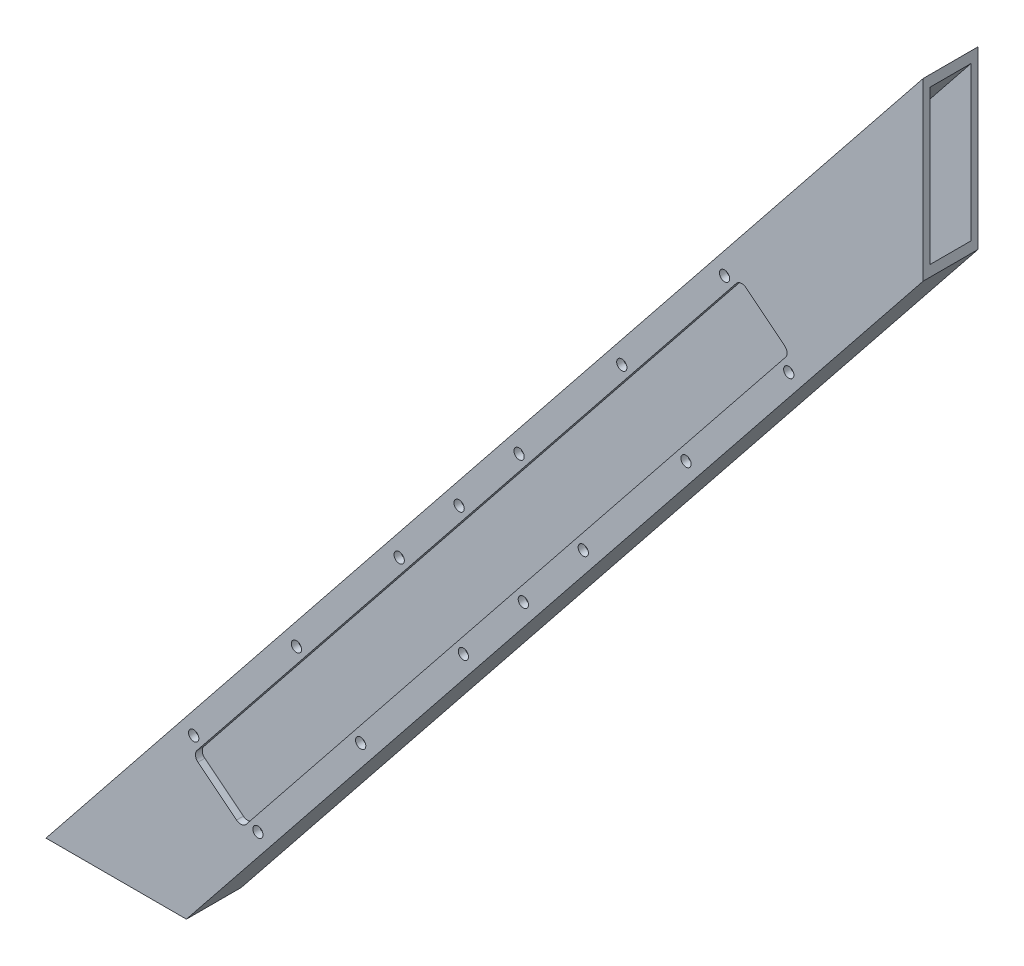
ISO-10303-21;
HEADER;
FILE_DESCRIPTION(('STEP AP214'),'2;1');
FILE_NAME('part.step','',(''),(''),'','','');
FILE_SCHEMA(('AUTOMOTIVE_DESIGN { 1 0 10303 214 1 1 1 1 }'));
ENDSEC;
DATA;
#1=APPLICATION_CONTEXT('core data for automotive mechanical design processes');
#2=APPLICATION_PROTOCOL_DEFINITION('international standard','automotive_design',2000,#1);
#3=PRODUCT_CONTEXT('',#1,'mechanical');
#4=PRODUCT('Part','Part','',(#3));
#5=PRODUCT_RELATED_PRODUCT_CATEGORY('part','',(#4));
#6=PRODUCT_DEFINITION_FORMATION('','',#4);
#7=PRODUCT_DEFINITION_CONTEXT('part definition',#1,'design');
#8=PRODUCT_DEFINITION('design','',#6,#7);
#9=PRODUCT_DEFINITION_SHAPE('','',#8);
#10=(LENGTH_UNIT() NAMED_UNIT(*) SI_UNIT(.MILLI.,.METRE.));
#11=(NAMED_UNIT(*) PLANE_ANGLE_UNIT() SI_UNIT($,.RADIAN.));
#12=(NAMED_UNIT(*) SI_UNIT($,.STERADIAN.) SOLID_ANGLE_UNIT());
#13=UNCERTAINTY_MEASURE_WITH_UNIT(LENGTH_MEASURE(1.E-05),#10,'distance_accuracy_value','');
#14=(GEOMETRIC_REPRESENTATION_CONTEXT(3) GLOBAL_UNCERTAINTY_ASSIGNED_CONTEXT((#13)) GLOBAL_UNIT_ASSIGNED_CONTEXT((#10,
#11,#12)) REPRESENTATION_CONTEXT('',''));
#15=CARTESIAN_POINT('',(0.,0.,0.));
#16=DIRECTION('',(0.,0.,1.));
#17=DIRECTION('',(1.,0.,0.));
#18=AXIS2_PLACEMENT_3D('',#15,#16,#17);
#19=CARTESIAN_POINT('',(65.0557422523179,0.,25.4));
#20=DIRECTION('',(0.,1.,0.));
#21=DIRECTION('',(-1.,0.,0.));
#22=AXIS2_PLACEMENT_3D('',#19,#20,#21);
#23=PLANE('',#22);
#24=DIRECTION('',(1.,0.,0.));
#25=VECTOR('',#24,1.);
#26=CARTESIAN_POINT('',(65.0557422523179,0.,0.));
#27=LINE('',#26,#25);
#28=CARTESIAN_POINT('',(0.,0.,0.));
#29=VERTEX_POINT('',#28);
#30=CARTESIAN_POINT('',(65.0557422523179,0.,0.));
#31=VERTEX_POINT('',#30);
#32=EDGE_CURVE('E184',#29,#31,#27,.T.);
#33=ORIENTED_EDGE('',*,*,#32,.T.);
#34=DIRECTION('',(0.,0.,-1.));
#35=VECTOR('',#34,1.);
#36=CARTESIAN_POINT('',(65.0557422523179,0.,25.4));
#37=LINE('',#36,#35);
#38=CARTESIAN_POINT('',(65.0557422523179,0.,25.4));
#39=VERTEX_POINT('',#38);
#40=EDGE_CURVE('E217',#39,#31,#37,.T.);
#41=ORIENTED_EDGE('',*,*,#40,.F.);
#42=DIRECTION('',(1.,0.,0.));
#43=VECTOR('',#42,1.);
#44=CARTESIAN_POINT('',(65.0557422523179,0.,25.4));
#45=LINE('',#44,#43);
#46=CARTESIAN_POINT('',(0.,0.,25.4));
#47=VERTEX_POINT('',#46);
#48=EDGE_CURVE('E191',#47,#39,#45,.T.);
#49=ORIENTED_EDGE('',*,*,#48,.F.);
#50=DIRECTION('',(0.,0.,-1.));
#51=VECTOR('',#50,1.);
#52=CARTESIAN_POINT('',(0.,0.,25.4));
#53=LINE('',#52,#51);
#54=EDGE_CURVE('E201',#47,#29,#53,.T.);
#55=ORIENTED_EDGE('',*,*,#54,.T.);
#56=EDGE_LOOP('',(#33,#41,#49,#55));
#57=FACE_BOUND('',#56,.T.);
#58=DIRECTION('',(1.,0.,0.));
#59=VECTOR('',#58,1.);
#60=CARTESIAN_POINT('',(65.0557422523179,0.,3.175));
#61=LINE('',#60,#59);
#62=CARTESIAN_POINT('',(4.06598389076986,0.,3.175));
#63=VERTEX_POINT('',#62);
#64=CARTESIAN_POINT('',(60.989758361548,0.,3.175));
#65=VERTEX_POINT('',#64);
#66=EDGE_CURVE('E156',#63,#65,#61,.T.);
#67=ORIENTED_EDGE('',*,*,#66,.F.);
#68=DIRECTION('',(0.,0.,-1.));
#69=VECTOR('',#68,1.);
#70=CARTESIAN_POINT('',(4.06598389076986,0.,25.4));
#71=LINE('',#70,#69);
#72=CARTESIAN_POINT('',(4.06598389076986,0.,22.225));
#73=VERTEX_POINT('',#72);
#74=EDGE_CURVE('E179',#73,#63,#71,.T.);
#75=ORIENTED_EDGE('',*,*,#74,.F.);
#76=DIRECTION('',(1.,0.,0.));
#77=VECTOR('',#76,1.);
#78=CARTESIAN_POINT('',(65.0557422523179,0.,22.225));
#79=LINE('',#78,#77);
#80=CARTESIAN_POINT('',(60.989758361548,0.,22.225));
#81=VERTEX_POINT('',#80);
#82=EDGE_CURVE('E175',#73,#81,#79,.T.);
#83=ORIENTED_EDGE('',*,*,#82,.T.);
#84=DIRECTION('',(0.,0.,-1.));
#85=VECTOR('',#84,1.);
#86=CARTESIAN_POINT('',(60.989758361548,0.,25.4));
#87=LINE('',#86,#85);
#88=EDGE_CURVE('E168',#81,#65,#87,.T.);
#89=ORIENTED_EDGE('',*,*,#88,.T.);
#90=EDGE_LOOP('',(#67,#75,#83,#89));
#91=FACE_BOUND('',#90,.T.);
#92=ADVANCED_FACE('F37',(#57,#91),#23,.F.);
#93=CARTESIAN_POINT('',(406.4,508.,25.4));
#94=DIRECTION('',(-1.,0.,0.));
#95=DIRECTION('',(0.,0.,1.));
#96=AXIS2_PLACEMENT_3D('',#93,#94,#95);
#97=PLANE('',#96);
#98=DIRECTION('',(0.,1.,0.));
#99=VECTOR('',#98,1.);
#100=CARTESIAN_POINT('',(406.4,508.,0.));
#101=LINE('',#100,#99);
#102=CARTESIAN_POINT('',(406.4,426.680322184603,0.));
#103=VERTEX_POINT('',#102);
#104=CARTESIAN_POINT('',(406.4,508.,0.));
#105=VERTEX_POINT('',#104);
#106=EDGE_CURVE('E206',#103,#105,#101,.T.);
#107=ORIENTED_EDGE('',*,*,#106,.T.);
#108=DIRECTION('',(0.,0.,-1.));
#109=VECTOR('',#108,1.);
#110=CARTESIAN_POINT('',(406.4,508.,25.4));
#111=LINE('',#110,#109);
#112=CARTESIAN_POINT('',(406.4,508.,25.4));
#113=VERTEX_POINT('',#112);
#114=EDGE_CURVE('E211',#113,#105,#111,.T.);
#115=ORIENTED_EDGE('',*,*,#114,.F.);
#116=DIRECTION('',(0.,1.,0.));
#117=VECTOR('',#116,1.);
#118=CARTESIAN_POINT('',(406.4,508.,25.4));
#119=LINE('',#118,#117);
#120=CARTESIAN_POINT('',(406.4,426.680322184603,25.4));
#121=VERTEX_POINT('',#120);
#122=EDGE_CURVE('E197',#121,#113,#119,.T.);
#123=ORIENTED_EDGE('',*,*,#122,.F.);
#124=DIRECTION('',(0.,0.,-1.));
#125=VECTOR('',#124,1.);
#126=CARTESIAN_POINT('',(406.4,426.680322184603,25.4));
#127=LINE('',#126,#125);
#128=EDGE_CURVE('E214',#121,#103,#127,.T.);
#129=ORIENTED_EDGE('',*,*,#128,.T.);
#130=EDGE_LOOP('',(#107,#115,#123,#129));
#131=FACE_BOUND('',#130,.T.);
#132=DIRECTION('',(0.,1.,0.));
#133=VECTOR('',#132,1.);
#134=CARTESIAN_POINT('',(406.4,508.,3.175));
#135=LINE('',#134,#133);
#136=CARTESIAN_POINT('',(406.4,431.762802048065,3.175));
#137=VERTEX_POINT('',#136);
#138=CARTESIAN_POINT('',(406.4,502.917520136538,3.175));
#139=VERTEX_POINT('',#138);
#140=EDGE_CURVE('E153',#137,#139,#135,.T.);
#141=ORIENTED_EDGE('',*,*,#140,.F.);
#142=DIRECTION('',(0.,0.,-1.));
#143=VECTOR('',#142,1.);
#144=CARTESIAN_POINT('',(406.4,431.762802048065,25.4));
#145=LINE('',#144,#143);
#146=CARTESIAN_POINT('',(406.4,431.762802048065,22.225));
#147=VERTEX_POINT('',#146);
#148=EDGE_CURVE('E163',#147,#137,#145,.T.);
#149=ORIENTED_EDGE('',*,*,#148,.F.);
#150=DIRECTION('',(0.,1.,0.));
#151=VECTOR('',#150,1.);
#152=CARTESIAN_POINT('',(406.4,508.,22.225));
#153=LINE('',#152,#151);
#154=CARTESIAN_POINT('',(406.4,502.917520136538,22.225));
#155=VERTEX_POINT('',#154);
#156=EDGE_CURVE('E180',#147,#155,#153,.T.);
#157=ORIENTED_EDGE('',*,*,#156,.T.);
#158=DIRECTION('',(0.,0.,-1.));
#159=VECTOR('',#158,1.);
#160=CARTESIAN_POINT('',(406.4,502.917520136538,25.4));
#161=LINE('',#160,#159);
#162=EDGE_CURVE('E169',#155,#139,#161,.T.);
#163=ORIENTED_EDGE('',*,*,#162,.T.);
#164=EDGE_LOOP('',(#141,#149,#157,#163));
#165=FACE_BOUND('',#164,.T.);
#166=ADVANCED_FACE('F172',(#131,#165),#97,.F.);
#167=CARTESIAN_POINT('',(406.4,426.680322184603,25.4));
#168=DIRECTION('',(-0.78086880944303,0.624695047554424,0.));
#169=DIRECTION('',(-0.624695047554424,-0.780868809443031,0.));
#170=AXIS2_PLACEMENT_3D('',#167,#168,#169);
#171=PLANE('',#170);
#172=DIRECTION('',(0.624695047554424,0.78086880944303,0.));
#173=VECTOR('',#172,1.);
#174=CARTESIAN_POINT('',(406.4,426.680322184603,0.));
#175=LINE('',#174,#173);
#176=EDGE_CURVE('E204',#31,#103,#175,.T.);
#177=ORIENTED_EDGE('',*,*,#176,.T.);
#178=ORIENTED_EDGE('',*,*,#128,.F.);
#179=DIRECTION('',(0.624695047554424,0.78086880944303,0.));
#180=VECTOR('',#179,1.);
#181=CARTESIAN_POINT('',(406.4,426.680322184603,25.4));
#182=LINE('',#181,#180);
#183=EDGE_CURVE('E194',#39,#121,#182,.T.);
#184=ORIENTED_EDGE('',*,*,#183,.F.);
#185=ORIENTED_EDGE('',*,*,#40,.T.);
#186=EDGE_LOOP('',(#177,#178,#184,#185));
#187=FACE_BOUND('',#186,.T.);
#188=ADVANCED_FACE('F365',(#187),#171,.F.);
#189=CARTESIAN_POINT('',(0.,0.,25.4));
#190=DIRECTION('',(0.78086880944303,-0.624695047554424,0.));
#191=DIRECTION('',(0.624695047554424,0.780868809443031,0.));
#192=AXIS2_PLACEMENT_3D('',#189,#190,#191);
#193=PLANE('',#192);
#194=DIRECTION('',(-0.624695047554424,-0.78086880944303,0.));
#195=VECTOR('',#194,1.);
#196=CARTESIAN_POINT('',(0.,0.,0.));
#197=LINE('',#196,#195);
#198=EDGE_CURVE('E195',#105,#29,#197,.T.);
#199=ORIENTED_EDGE('',*,*,#198,.T.);
#200=ORIENTED_EDGE('',*,*,#54,.F.);
#201=DIRECTION('',(-0.624695047554424,-0.78086880944303,0.));
#202=VECTOR('',#201,1.);
#203=CARTESIAN_POINT('',(0.,0.,25.4));
#204=LINE('',#203,#202);
#205=EDGE_CURVE('E199',#113,#47,#204,.T.);
#206=ORIENTED_EDGE('',*,*,#205,.F.);
#207=ORIENTED_EDGE('',*,*,#114,.T.);
#208=EDGE_LOOP('',(#199,#200,#206,#207));
#209=FACE_BOUND('',#208,.T.);
#210=ADVANCED_FACE('F474',(#209),#193,.F.);
#211=CARTESIAN_POINT('',(0.,0.,25.4));
#212=DIRECTION('',(0.,0.,1.));
#213=DIRECTION('',(1.,0.,0.));
#214=AXIS2_PLACEMENT_3D('',#211,#212,#213);
#215=PLANE('',#214);
#216=CARTESIAN_POINT('',(296.519313009802,299.49442317378,25.4));
#217=DIRECTION('',(0.,0.,1.));
#218=DIRECTION('',(1.,0.,0.));
#219=AXIS2_PLACEMENT_3D('',#216,#217,#218);
#220=CIRCLE('',#219,2.38125000000007);
#221=CARTESIAN_POINT('',(298.900563009802,299.49442317378,25.4));
#222=VERTEX_POINT('',#221);
#223=EDGE_CURVE('E699',#222,#222,#220,.T.);
#224=ORIENTED_EDGE('',*,*,#223,.F.);
#225=EDGE_LOOP('',(#224));
#226=FACE_BOUND('',#225,.T.);
#227=CARTESIAN_POINT('',(344.121075633449,358.996626453339,25.4));
#228=DIRECTION('',(0.,0.,1.));
#229=DIRECTION('',(1.,0.,0.));
#230=AXIS2_PLACEMENT_3D('',#227,#228,#229);
#231=CIRCLE('',#230,2.38125000000001);
#232=CARTESIAN_POINT('',(346.502325633449,358.996626453339,25.4));
#233=VERTEX_POINT('',#232);
#234=EDGE_CURVE('E701',#233,#233,#231,.T.);
#235=ORIENTED_EDGE('',*,*,#234,.F.);
#236=EDGE_LOOP('',(#235));
#237=FACE_BOUND('',#236,.T.);
#238=CARTESIAN_POINT('',(98.1786354112725,51.5685761756177,25.4));
#239=DIRECTION('',(0.,0.,1.));
#240=DIRECTION('',(-1.,0.,0.));
#241=AXIS2_PLACEMENT_3D('',#238,#239,#240);
#242=CIRCLE('',#241,2.38125);
#243=CARTESIAN_POINT('',(95.7973854112725,51.5685761756177,25.4));
#244=VERTEX_POINT('',#243);
#245=EDGE_CURVE('E705',#244,#244,#242,.T.);
#246=ORIENTED_EDGE('',*,*,#245,.F.);
#247=EDGE_LOOP('',(#246));
#248=FACE_BOUND('',#247,.T.);
#249=CARTESIAN_POINT('',(145.78039803492,111.070779455177,25.4));
#250=DIRECTION('',(0.,0.,1.));
#251=DIRECTION('',(-1.,0.,0.));
#252=AXIS2_PLACEMENT_3D('',#249,#250,#251);
#253=CIRCLE('',#252,2.38125);
#254=CARTESIAN_POINT('',(143.39914803492,111.070779455177,25.4));
#255=VERTEX_POINT('',#254);
#256=EDGE_CURVE('E721',#255,#255,#253,.T.);
#257=ORIENTED_EDGE('',*,*,#256,.F.);
#258=EDGE_LOOP('',(#257));
#259=FACE_BOUND('',#258,.T.);
#260=CARTESIAN_POINT('',(193.382160658567,170.572982734736,25.4));
#261=DIRECTION('',(0.,0.,1.));
#262=DIRECTION('',(-1.,0.,0.));
#263=AXIS2_PLACEMENT_3D('',#260,#261,#262);
#264=CIRCLE('',#263,2.38124999999995);
#265=CARTESIAN_POINT('',(191.000910658567,170.572982734736,25.4));
#266=VERTEX_POINT('',#265);
#267=EDGE_CURVE('E719',#266,#266,#264,.T.);
#268=ORIENTED_EDGE('',*,*,#267,.F.);
#269=EDGE_LOOP('',(#268));
#270=FACE_BOUND('',#269,.T.);
#271=CARTESIAN_POINT('',(163.631059018787,194.373864046559,25.4));
#272=DIRECTION('',(0.,0.,1.));
#273=DIRECTION('',(1.,0.,0.));
#274=AXIS2_PLACEMENT_3D('',#271,#272,#273);
#275=CIRCLE('',#274,2.38124999999998);
#276=CARTESIAN_POINT('',(166.012309018787,194.373864046559,25.4));
#277=VERTEX_POINT('',#276);
#278=EDGE_CURVE('E717',#277,#277,#275,.T.);
#279=ORIENTED_EDGE('',*,*,#278,.F.);
#280=EDGE_LOOP('',(#279));
#281=FACE_BOUND('',#280,.T.);
#282=CARTESIAN_POINT('',(116.02929639514,134.871660767,25.4));
#283=DIRECTION('',(0.,0.,1.));
#284=DIRECTION('',(1.,0.,0.));
#285=AXIS2_PLACEMENT_3D('',#282,#283,#284);
#286=CIRCLE('',#285,2.38125);
#287=CARTESIAN_POINT('',(118.41054639514,134.871660767,25.4));
#288=VERTEX_POINT('',#287);
#289=EDGE_CURVE('E714',#288,#288,#286,.T.);
#290=ORIENTED_EDGE('',*,*,#289,.F.);
#291=EDGE_LOOP('',(#290));
#292=FACE_BOUND('',#291,.T.);
#293=CARTESIAN_POINT('',(68.4275337714929,75.3694574874414,25.4));
#294=DIRECTION('',(0.,0.,1.));
#295=DIRECTION('',(1.,0.,0.));
#296=AXIS2_PLACEMENT_3D('',#293,#294,#295);
#297=CIRCLE('',#296,2.38125);
#298=CARTESIAN_POINT('',(70.8087837714929,75.3694574874414,25.4));
#299=VERTEX_POINT('',#298);
#300=EDGE_CURVE('E336',#299,#299,#297,.T.);
#301=ORIENTED_EDGE('',*,*,#300,.F.);
#302=EDGE_LOOP('',(#301));
#303=FACE_BOUND('',#302,.T.);
#304=CARTESIAN_POINT('',(248.917550386155,239.992219894221,25.4));
#305=DIRECTION('',(0.,0.,1.));
#306=DIRECTION('',(1.,0.,0.));
#307=AXIS2_PLACEMENT_3D('',#304,#305,#306);
#308=CIRCLE('',#307,2.38124999999986);
#309=CARTESIAN_POINT('',(251.298800386155,239.992219894221,25.4));
#310=VERTEX_POINT('',#309);
#311=EDGE_CURVE('E702',#310,#310,#308,.T.);
#312=ORIENTED_EDGE('',*,*,#311,.F.);
#313=EDGE_LOOP('',(#312));
#314=FACE_BOUND('',#313,.T.);
#315=CARTESIAN_POINT('',(219.166448746375,263.793101206044,25.4));
#316=DIRECTION('',(0.,0.,1.));
#317=DIRECTION('',(-1.,0.,0.));
#318=AXIS2_PLACEMENT_3D('',#315,#316,#317);
#319=CIRCLE('',#318,2.38124999999994);
#320=CARTESIAN_POINT('',(216.785198746375,263.793101206044,25.4));
#321=VERTEX_POINT('',#320);
#322=EDGE_CURVE('E708',#321,#321,#319,.T.);
#323=ORIENTED_EDGE('',*,*,#322,.F.);
#324=EDGE_LOOP('',(#323));
#325=FACE_BOUND('',#324,.T.);
#326=CARTESIAN_POINT('',(266.768211370022,323.295304485603,25.4));
#327=DIRECTION('',(0.,0.,1.));
#328=DIRECTION('',(-1.,0.,0.));
#329=AXIS2_PLACEMENT_3D('',#326,#327,#328);
#330=CIRCLE('',#329,2.38125000000001);
#331=CARTESIAN_POINT('',(264.386961370022,323.295304485603,25.4));
#332=VERTEX_POINT('',#331);
#333=EDGE_CURVE('E737',#332,#332,#330,.T.);
#334=ORIENTED_EDGE('',*,*,#333,.F.);
#335=EDGE_LOOP('',(#334));
#336=FACE_BOUND('',#335,.T.);
#337=CARTESIAN_POINT('',(314.369973993669,382.797507765162,25.4));
#338=DIRECTION('',(0.,0.,1.));
#339=DIRECTION('',(-1.,0.,0.));
#340=AXIS2_PLACEMENT_3D('',#337,#338,#339);
#341=CIRCLE('',#340,2.38125000000001);
#342=CARTESIAN_POINT('',(311.988723993669,382.797507765162,25.4));
#343=VERTEX_POINT('',#342);
#344=EDGE_CURVE('E734',#343,#343,#341,.T.);
#345=ORIENTED_EDGE('',*,*,#344,.F.);
#346=EDGE_LOOP('',(#345));
#347=FACE_BOUND('',#346,.T.);
#348=CARTESIAN_POINT('',(191.398753882581,229.083482626302,25.4));
#349=DIRECTION('',(0.,0.,1.));
#350=DIRECTION('',(1.,0.,0.));
#351=AXIS2_PLACEMENT_3D('',#348,#349,#350);
#352=CIRCLE('',#351,2.38125);
#353=CARTESIAN_POINT('',(193.780003882581,229.083482626302,25.4));
#354=VERTEX_POINT('',#353);
#355=EDGE_CURVE('E731',#354,#354,#352,.T.);
#356=ORIENTED_EDGE('',*,*,#355,.F.);
#357=EDGE_LOOP('',(#356));
#358=FACE_BOUND('',#357,.T.);
#359=CARTESIAN_POINT('',(221.149855522361,205.282601314478,25.4));
#360=DIRECTION('',(0.,0.,1.));
#361=DIRECTION('',(1.,0.,0.));
#362=AXIS2_PLACEMENT_3D('',#359,#360,#361);
#363=CIRCLE('',#362,2.38125);
#364=CARTESIAN_POINT('',(223.531105522361,205.282601314478,25.4));
#365=VERTEX_POINT('',#364);
#366=EDGE_CURVE('E728',#365,#365,#363,.T.);
#367=ORIENTED_EDGE('',*,*,#366,.F.);
#368=EDGE_LOOP('',(#367));
#369=FACE_BOUND('',#368,.T.);
#370=DIRECTION('',(0.78086880944303,-0.624695047554425,0.));
#371=VECTOR('',#370,1.);
#372=CARTESIAN_POINT('',(90.7408600013274,49.3868287220339,25.4));
#373=LINE('',#372,#371);
#374=CARTESIAN_POINT('',(70.4109405474781,65.6507642851133,25.4));
#375=VERTEX_POINT('',#374);
#376=CARTESIAN_POINT('',(88.2616015313457,51.3702354980192,25.4));
#377=VERTEX_POINT('',#376);
#378=EDGE_CURVE('E308',#375,#377,#373,.T.);
#379=ORIENTED_EDGE('',*,*,#378,.F.);
#380=CARTESIAN_POINT('',(72.3943473234634,68.1300227550949,25.4));
#381=DIRECTION('',(0.,0.,1.));
#382=DIRECTION('',(1.,0.,0.));
#383=AXIS2_PLACEMENT_3D('',#380,#381,#382);
#384=CIRCLE('',#383,3.175);
#385=CARTESIAN_POINT('',(69.9150888534818,70.1134295310802,25.4));
#386=VERTEX_POINT('',#385);
#387=EDGE_CURVE('E45',#375,#386,#384,.F.);
#388=ORIENTED_EDGE('',*,*,#387,.T.);
#389=DIRECTION('',(-0.624695047554424,-0.780868809443031,0.));
#390=VECTOR('',#389,1.);
#391=CARTESIAN_POINT('',(67.9316820774965,67.6341710610986,25.4));
#392=LINE('',#391,#390);
#393=CARTESIAN_POINT('',(319.824342627629,382.499996748765,25.4));
#394=VERTEX_POINT('',#393);
#395=EDGE_CURVE('E235',#394,#386,#392,.T.);
#396=ORIENTED_EDGE('',*,*,#395,.F.);
#397=CARTESIAN_POINT('',(322.303601097611,380.516589972779,25.4));
#398=DIRECTION('',(0.,0.,1.));
#399=DIRECTION('',(1.,0.,0.));
#400=AXIS2_PLACEMENT_3D('',#397,#398,#399);
#401=CIRCLE('',#400,3.175);
#402=CARTESIAN_POINT('',(324.287007873596,382.995848442761,25.4));
#403=VERTEX_POINT('',#402);
#404=EDGE_CURVE('E291',#394,#403,#401,.F.);
#405=ORIENTED_EDGE('',*,*,#404,.T.);
#406=DIRECTION('',(-0.780868809443031,0.624695047554424,0.));
#407=VECTOR('',#406,1.);
#408=CARTESIAN_POINT('',(344.616927327445,366.731912879681,25.4));
#409=LINE('',#408,#407);
#410=CARTESIAN_POINT('',(342.137668857464,368.715319655667,25.4));
#411=VERTEX_POINT('',#410);
#412=EDGE_CURVE('E316',#411,#403,#409,.T.);
#413=ORIENTED_EDGE('',*,*,#412,.F.);
#414=CARTESIAN_POINT('',(340.154262081478,366.236061185685,25.4));
#415=DIRECTION('',(0.,0.,1.));
#416=DIRECTION('',(1.,0.,0.));
#417=AXIS2_PLACEMENT_3D('',#414,#415,#416);
#418=CIRCLE('',#417,3.175);
#419=CARTESIAN_POINT('',(342.63352055146,364.2526544097,25.4));
#420=VERTEX_POINT('',#419);
#421=EDGE_CURVE('E295',#411,#420,#418,.F.);
#422=ORIENTED_EDGE('',*,*,#421,.T.);
#423=DIRECTION('',(0.624695047554424,0.780868809443031,0.));
#424=VECTOR('',#423,1.);
#425=CARTESIAN_POINT('',(90.7408600013274,49.3868287220339,25.4));
#426=LINE('',#425,#424);
#427=CARTESIAN_POINT('',(92.7242667773127,51.8660871920155,25.4));
#428=VERTEX_POINT('',#427);
#429=EDGE_CURVE('E330',#428,#420,#426,.T.);
#430=ORIENTED_EDGE('',*,*,#429,.F.);
#431=CARTESIAN_POINT('',(90.245008307331,53.8494939680008,25.4));
#432=DIRECTION('',(0.,0.,1.));
#433=DIRECTION('',(1.,0.,0.));
#434=AXIS2_PLACEMENT_3D('',#431,#432,#433);
#435=CIRCLE('',#434,3.175);
#436=EDGE_CURVE('E299',#428,#377,#435,.F.);
#437=ORIENTED_EDGE('',*,*,#436,.T.);
#438=EDGE_LOOP('',(#379,#388,#396,#405,#413,#422,#430,#437));
#439=FACE_BOUND('',#438,.T.);
#440=ORIENTED_EDGE('',*,*,#48,.T.);
#441=ORIENTED_EDGE('',*,*,#183,.T.);
#442=ORIENTED_EDGE('',*,*,#122,.T.);
#443=ORIENTED_EDGE('',*,*,#205,.T.);
#444=EDGE_LOOP('',(#440,#441,#442,#443));
#445=FACE_BOUND('',#444,.T.);
#446=ADVANCED_FACE('F306',(#226,#237,#248,#259,#270,#281,#292,#303,#314,#325,#336,#347,#358,
#369,#439,#445),#215,.T.);
#447=CARTESIAN_POINT('',(0.,0.,0.));
#448=DIRECTION('',(0.,0.,1.));
#449=DIRECTION('',(1.,0.,0.));
#450=AXIS2_PLACEMENT_3D('',#447,#448,#449);
#451=PLANE('',#450);
#452=ORIENTED_EDGE('',*,*,#32,.F.);
#453=ORIENTED_EDGE('',*,*,#198,.F.);
#454=ORIENTED_EDGE('',*,*,#106,.F.);
#455=ORIENTED_EDGE('',*,*,#176,.F.);
#456=EDGE_LOOP('',(#452,#453,#454,#455));
#457=FACE_BOUND('',#456,.T.);
#458=ADVANCED_FACE('F458',(#457),#451,.F.);
#459=CARTESIAN_POINT('',(403.920741530018,428.663728960588,25.4));
#460=DIRECTION('',(-0.78086880944303,0.624695047554424,0.));
#461=DIRECTION('',(-0.624695047554424,-0.780868809443031,0.));
#462=AXIS2_PLACEMENT_3D('',#459,#460,#461);
#463=PLANE('',#462);
#464=DIRECTION('',(0.624695047554424,0.780868809443031,0.));
#465=VECTOR('',#464,1.);
#466=CARTESIAN_POINT('',(403.920741530018,428.663728960588,3.175));
#467=LINE('',#466,#465);
#468=EDGE_CURVE('E149',#65,#137,#467,.T.);
#469=ORIENTED_EDGE('',*,*,#468,.F.);
#470=ORIENTED_EDGE('',*,*,#88,.F.);
#471=DIRECTION('',(0.624695047554424,0.780868809443031,0.));
#472=VECTOR('',#471,1.);
#473=CARTESIAN_POINT('',(403.920741530018,428.663728960588,22.225));
#474=LINE('',#473,#472);
#475=EDGE_CURVE('E165',#81,#147,#474,.T.);
#476=ORIENTED_EDGE('',*,*,#475,.T.);
#477=ORIENTED_EDGE('',*,*,#148,.T.);
#478=EDGE_LOOP('',(#469,#470,#476,#477));
#479=FACE_BOUND('',#478,.T.);
#480=ADVANCED_FACE('F164',(#479),#463,.T.);
#481=CARTESIAN_POINT('',(2.47925846998162,-1.9834067759853,25.4));
#482=DIRECTION('',(0.78086880944303,-0.624695047554424,0.));
#483=DIRECTION('',(0.624695047554424,0.780868809443031,0.));
#484=AXIS2_PLACEMENT_3D('',#481,#482,#483);
#485=PLANE('',#484);
#486=DIRECTION('',(-0.624695047554424,-0.780868809443031,0.));
#487=VECTOR('',#486,1.);
#488=CARTESIAN_POINT('',(2.47925846998162,-1.9834067759853,3.175));
#489=LINE('',#488,#487);
#490=EDGE_CURVE('E173',#139,#63,#489,.T.);
#491=ORIENTED_EDGE('',*,*,#490,.F.);
#492=ORIENTED_EDGE('',*,*,#162,.F.);
#493=DIRECTION('',(-0.624695047554424,-0.780868809443031,0.));
#494=VECTOR('',#493,1.);
#495=CARTESIAN_POINT('',(2.47925846998162,-1.9834067759853,22.225));
#496=LINE('',#495,#494);
#497=EDGE_CURVE('E182',#155,#73,#496,.T.);
#498=ORIENTED_EDGE('',*,*,#497,.T.);
#499=ORIENTED_EDGE('',*,*,#74,.T.);
#500=EDGE_LOOP('',(#491,#492,#498,#499));
#501=FACE_BOUND('',#500,.T.);
#502=ADVANCED_FACE('F345',(#501),#485,.T.);
#503=CARTESIAN_POINT('',(0.,0.,22.225));
#504=DIRECTION('',(0.,0.,1.));
#505=DIRECTION('',(1.,0.,0.));
#506=AXIS2_PLACEMENT_3D('',#503,#504,#505);
#507=PLANE('',#506);
#508=CARTESIAN_POINT('',(296.519313009802,299.49442317378,22.225));
#509=DIRECTION('',(0.,0.,1.));
#510=DIRECTION('',(1.,0.,0.));
#511=AXIS2_PLACEMENT_3D('',#508,#509,#510);
#512=CIRCLE('',#511,2.38125000000007);
#513=CARTESIAN_POINT('',(298.900563009802,299.49442317378,22.225));
#514=VERTEX_POINT('',#513);
#515=EDGE_CURVE('E190',#514,#514,#512,.T.);
#516=ORIENTED_EDGE('',*,*,#515,.T.);
#517=EDGE_LOOP('',(#516));
#518=FACE_BOUND('',#517,.T.);
#519=CARTESIAN_POINT('',(344.121075633449,358.996626453339,22.225));
#520=DIRECTION('',(0.,0.,1.));
#521=DIRECTION('',(1.,0.,0.));
#522=AXIS2_PLACEMENT_3D('',#519,#520,#521);
#523=CIRCLE('',#522,2.38125000000001);
#524=CARTESIAN_POINT('',(346.502325633449,358.996626453339,22.225));
#525=VERTEX_POINT('',#524);
#526=EDGE_CURVE('E268',#525,#525,#523,.T.);
#527=ORIENTED_EDGE('',*,*,#526,.T.);
#528=EDGE_LOOP('',(#527));
#529=FACE_BOUND('',#528,.T.);
#530=CARTESIAN_POINT('',(98.1786354112725,51.5685761756177,22.225));
#531=DIRECTION('',(0.,0.,1.));
#532=DIRECTION('',(1.,0.,0.));
#533=AXIS2_PLACEMENT_3D('',#530,#531,#532);
#534=CIRCLE('',#533,2.38125);
#535=CARTESIAN_POINT('',(100.559885411272,51.5685761756177,22.225));
#536=VERTEX_POINT('',#535);
#537=EDGE_CURVE('E265',#536,#536,#534,.T.);
#538=ORIENTED_EDGE('',*,*,#537,.T.);
#539=EDGE_LOOP('',(#538));
#540=FACE_BOUND('',#539,.T.);
#541=CARTESIAN_POINT('',(145.78039803492,111.070779455177,22.225));
#542=DIRECTION('',(0.,0.,1.));
#543=DIRECTION('',(1.,0.,0.));
#544=AXIS2_PLACEMENT_3D('',#541,#542,#543);
#545=CIRCLE('',#544,2.38125);
#546=CARTESIAN_POINT('',(148.16164803492,111.070779455177,22.225));
#547=VERTEX_POINT('',#546);
#548=EDGE_CURVE('E262',#547,#547,#545,.T.);
#549=ORIENTED_EDGE('',*,*,#548,.T.);
#550=EDGE_LOOP('',(#549));
#551=FACE_BOUND('',#550,.T.);
#552=CARTESIAN_POINT('',(193.382160658567,170.572982734736,22.225));
#553=DIRECTION('',(0.,0.,1.));
#554=DIRECTION('',(1.,0.,0.));
#555=AXIS2_PLACEMENT_3D('',#552,#553,#554);
#556=CIRCLE('',#555,2.38124999999995);
#557=CARTESIAN_POINT('',(195.763410658567,170.572982734736,22.225));
#558=VERTEX_POINT('',#557);
#559=EDGE_CURVE('E259',#558,#558,#556,.T.);
#560=ORIENTED_EDGE('',*,*,#559,.T.);
#561=EDGE_LOOP('',(#560));
#562=FACE_BOUND('',#561,.T.);
#563=CARTESIAN_POINT('',(163.631059018787,194.373864046559,22.225));
#564=DIRECTION('',(0.,0.,1.));
#565=DIRECTION('',(1.,0.,0.));
#566=AXIS2_PLACEMENT_3D('',#563,#564,#565);
#567=CIRCLE('',#566,2.38124999999998);
#568=CARTESIAN_POINT('',(166.012309018787,194.373864046559,22.225));
#569=VERTEX_POINT('',#568);
#570=EDGE_CURVE('E256',#569,#569,#567,.T.);
#571=ORIENTED_EDGE('',*,*,#570,.T.);
#572=EDGE_LOOP('',(#571));
#573=FACE_BOUND('',#572,.T.);
#574=CARTESIAN_POINT('',(116.02929639514,134.871660767,22.225));
#575=DIRECTION('',(0.,0.,1.));
#576=DIRECTION('',(1.,0.,0.));
#577=AXIS2_PLACEMENT_3D('',#574,#575,#576);
#578=CIRCLE('',#577,2.38125);
#579=CARTESIAN_POINT('',(118.41054639514,134.871660767,22.225));
#580=VERTEX_POINT('',#579);
#581=EDGE_CURVE('E253',#580,#580,#578,.T.);
#582=ORIENTED_EDGE('',*,*,#581,.T.);
#583=EDGE_LOOP('',(#582));
#584=FACE_BOUND('',#583,.T.);
#585=CARTESIAN_POINT('',(68.4275337714929,75.3694574874414,22.225));
#586=DIRECTION('',(0.,0.,1.));
#587=DIRECTION('',(1.,0.,0.));
#588=AXIS2_PLACEMENT_3D('',#585,#586,#587);
#589=CIRCLE('',#588,2.38125);
#590=CARTESIAN_POINT('',(70.8087837714929,75.3694574874414,22.225));
#591=VERTEX_POINT('',#590);
#592=EDGE_CURVE('E250',#591,#591,#589,.T.);
#593=ORIENTED_EDGE('',*,*,#592,.T.);
#594=EDGE_LOOP('',(#593));
#595=FACE_BOUND('',#594,.T.);
#596=CARTESIAN_POINT('',(248.917550386155,239.992219894221,22.225));
#597=DIRECTION('',(0.,0.,1.));
#598=DIRECTION('',(1.,0.,0.));
#599=AXIS2_PLACEMENT_3D('',#596,#597,#598);
#600=CIRCLE('',#599,2.38124999999986);
#601=CARTESIAN_POINT('',(251.298800386155,239.992219894221,22.225));
#602=VERTEX_POINT('',#601);
#603=EDGE_CURVE('E247',#602,#602,#600,.T.);
#604=ORIENTED_EDGE('',*,*,#603,.T.);
#605=EDGE_LOOP('',(#604));
#606=FACE_BOUND('',#605,.T.);
#607=CARTESIAN_POINT('',(219.166448746375,263.793101206044,22.225));
#608=DIRECTION('',(0.,0.,1.));
#609=DIRECTION('',(1.,0.,0.));
#610=AXIS2_PLACEMENT_3D('',#607,#608,#609);
#611=CIRCLE('',#610,2.38124999999994);
#612=CARTESIAN_POINT('',(221.547698746375,263.793101206044,22.225));
#613=VERTEX_POINT('',#612);
#614=EDGE_CURVE('E244',#613,#613,#611,.T.);
#615=ORIENTED_EDGE('',*,*,#614,.T.);
#616=EDGE_LOOP('',(#615));
#617=FACE_BOUND('',#616,.T.);
#618=CARTESIAN_POINT('',(266.768211370022,323.295304485603,22.225));
#619=DIRECTION('',(0.,0.,1.));
#620=DIRECTION('',(1.,0.,0.));
#621=AXIS2_PLACEMENT_3D('',#618,#619,#620);
#622=CIRCLE('',#621,2.38125000000001);
#623=CARTESIAN_POINT('',(269.149461370022,323.295304485603,22.225));
#624=VERTEX_POINT('',#623);
#625=EDGE_CURVE('E241',#624,#624,#622,.T.);
#626=ORIENTED_EDGE('',*,*,#625,.T.);
#627=EDGE_LOOP('',(#626));
#628=FACE_BOUND('',#627,.T.);
#629=CARTESIAN_POINT('',(314.369973993669,382.797507765162,22.225));
#630=DIRECTION('',(0.,0.,1.));
#631=DIRECTION('',(1.,0.,0.));
#632=AXIS2_PLACEMENT_3D('',#629,#630,#631);
#633=CIRCLE('',#632,2.38125000000001);
#634=CARTESIAN_POINT('',(316.751223993669,382.797507765162,22.225));
#635=VERTEX_POINT('',#634);
#636=EDGE_CURVE('E238',#635,#635,#633,.T.);
#637=ORIENTED_EDGE('',*,*,#636,.T.);
#638=EDGE_LOOP('',(#637));
#639=FACE_BOUND('',#638,.T.);
#640=CARTESIAN_POINT('',(191.398753882581,229.083482626302,22.225));
#641=DIRECTION('',(0.,0.,1.));
#642=DIRECTION('',(1.,0.,0.));
#643=AXIS2_PLACEMENT_3D('',#640,#641,#642);
#644=CIRCLE('',#643,2.38125);
#645=CARTESIAN_POINT('',(193.780003882581,229.083482626302,22.225));
#646=VERTEX_POINT('',#645);
#647=EDGE_CURVE('E234',#646,#646,#644,.T.);
#648=ORIENTED_EDGE('',*,*,#647,.T.);
#649=EDGE_LOOP('',(#648));
#650=FACE_BOUND('',#649,.T.);
#651=CARTESIAN_POINT('',(221.149855522361,205.282601314478,22.225));
#652=DIRECTION('',(0.,0.,1.));
#653=DIRECTION('',(1.,0.,0.));
#654=AXIS2_PLACEMENT_3D('',#651,#652,#653);
#655=CIRCLE('',#654,2.38125);
#656=CARTESIAN_POINT('',(223.531105522361,205.282601314478,22.225));
#657=VERTEX_POINT('',#656);
#658=EDGE_CURVE('E231',#657,#657,#655,.T.);
#659=ORIENTED_EDGE('',*,*,#658,.T.);
#660=EDGE_LOOP('',(#659));
#661=FACE_BOUND('',#660,.T.);
#662=DIRECTION('',(-0.780868809443031,0.624695047554424,0.));
#663=VECTOR('',#662,1.);
#664=CARTESIAN_POINT('',(313.378270605677,391.722838257096,22.225));
#665=LINE('',#664,#663);
#666=CARTESIAN_POINT('',(342.137668857464,368.715319655667,22.225));
#667=VERTEX_POINT('',#666);
#668=CARTESIAN_POINT('',(324.287007873596,382.995848442761,22.225));
#669=VERTEX_POINT('',#668);
#670=EDGE_CURVE('E223',#667,#669,#665,.T.);
#671=ORIENTED_EDGE('',*,*,#670,.T.);
#672=CARTESIAN_POINT('',(322.303601097611,380.516589972779,22.225));
#673=DIRECTION('',(0.,0.,1.));
#674=DIRECTION('',(1.,0.,0.));
#675=AXIS2_PLACEMENT_3D('',#672,#673,#674);
#676=CIRCLE('',#675,3.175);
#677=CARTESIAN_POINT('',(319.824342627629,382.499996748765,22.225));
#678=VERTEX_POINT('',#677);
#679=EDGE_CURVE('E293',#669,#678,#676,.T.);
#680=ORIENTED_EDGE('',*,*,#679,.T.);
#681=DIRECTION('',(-0.624695047554424,-0.780868809443031,0.));
#682=VECTOR('',#681,1.);
#683=CARTESIAN_POINT('',(8.42947879793763,-6.7435830383501,22.225));
#684=LINE('',#683,#682);
#685=CARTESIAN_POINT('',(69.9150888534818,70.1134295310803,22.225));
#686=VERTEX_POINT('',#685);
#687=EDGE_CURVE('E226',#678,#686,#684,.T.);
#688=ORIENTED_EDGE('',*,*,#687,.T.);
#689=CARTESIAN_POINT('',(72.3943473234634,68.1300227550949,22.225));
#690=DIRECTION('',(0.,0.,1.));
#691=DIRECTION('',(1.,0.,0.));
#692=AXIS2_PLACEMENT_3D('',#689,#690,#691);
#693=CIRCLE('',#692,3.175);
#694=CARTESIAN_POINT('',(70.4109405474781,65.6507642851133,22.225));
#695=VERTEX_POINT('',#694);
#696=EDGE_CURVE('E11',#686,#695,#693,.T.);
#697=ORIENTED_EDGE('',*,*,#696,.T.);
#698=DIRECTION('',(0.78086880944303,-0.624695047554425,0.));
#699=VECTOR('',#698,1.);
#700=CARTESIAN_POINT('',(59.502203279559,74.3777540994487,22.225));
#701=LINE('',#700,#699);
#702=CARTESIAN_POINT('',(88.2616015313458,51.3702354980192,22.225));
#703=VERTEX_POINT('',#702);
#704=EDGE_CURVE('E228',#695,#703,#701,.T.);
#705=ORIENTED_EDGE('',*,*,#704,.T.);
#706=CARTESIAN_POINT('',(90.245008307331,53.8494939680008,22.225));
#707=DIRECTION('',(0.,0.,1.));
#708=DIRECTION('',(1.,0.,0.));
#709=AXIS2_PLACEMENT_3D('',#706,#707,#708);
#710=CIRCLE('',#709,3.175);
#711=CARTESIAN_POINT('',(92.7242667773126,51.8660871920155,22.225));
#712=VERTEX_POINT('',#711);
#713=EDGE_CURVE('E301',#703,#712,#710,.T.);
#714=ORIENTED_EDGE('',*,*,#713,.T.);
#715=DIRECTION('',(0.624695047554424,0.78086880944303,0.));
#716=VECTOR('',#715,1.);
#717=CARTESIAN_POINT('',(31.2386567217685,-24.9909253774147,22.225));
#718=LINE('',#717,#716);
#719=CARTESIAN_POINT('',(342.63352055146,364.2526544097,22.225));
#720=VERTEX_POINT('',#719);
#721=EDGE_CURVE('E220',#712,#720,#718,.T.);
#722=ORIENTED_EDGE('',*,*,#721,.T.);
#723=CARTESIAN_POINT('',(340.154262081478,366.236061185685,22.225));
#724=DIRECTION('',(0.,0.,1.));
#725=DIRECTION('',(1.,0.,0.));
#726=AXIS2_PLACEMENT_3D('',#723,#724,#725);
#727=CIRCLE('',#726,3.175);
#728=EDGE_CURVE('E297',#720,#667,#727,.T.);
#729=ORIENTED_EDGE('',*,*,#728,.T.);
#730=EDGE_LOOP('',(#671,#680,#688,#697,#705,#714,#722,#729));
#731=FACE_BOUND('',#730,.T.);
#732=ORIENTED_EDGE('',*,*,#82,.F.);
#733=ORIENTED_EDGE('',*,*,#497,.F.);
#734=ORIENTED_EDGE('',*,*,#156,.F.);
#735=ORIENTED_EDGE('',*,*,#475,.F.);
#736=EDGE_LOOP('',(#732,#733,#734,#735));
#737=FACE_BOUND('',#736,.T.);
#738=ADVANCED_FACE('F320',(#518,#529,#540,#551,#562,#573,#584,#595,#606,#617,#628,#639,#650,
#661,#731,#737),#507,.F.);
#739=CARTESIAN_POINT('',(0.,0.,3.175));
#740=DIRECTION('',(0.,0.,1.));
#741=DIRECTION('',(1.,0.,0.));
#742=AXIS2_PLACEMENT_3D('',#739,#740,#741);
#743=PLANE('',#742);
#744=ORIENTED_EDGE('',*,*,#66,.T.);
#745=ORIENTED_EDGE('',*,*,#468,.T.);
#746=ORIENTED_EDGE('',*,*,#140,.T.);
#747=ORIENTED_EDGE('',*,*,#490,.T.);
#748=EDGE_LOOP('',(#744,#745,#746,#747));
#749=FACE_BOUND('',#748,.T.);
#750=ADVANCED_FACE('F151',(#749),#743,.T.);
#751=CARTESIAN_POINT('',(90.7408600013274,49.3868287220339,20.32));
#752=DIRECTION('',(-0.624695047554425,-0.78086880944303,0.));
#753=DIRECTION('',(0.78086880944303,-0.624695047554425,0.));
#754=AXIS2_PLACEMENT_3D('',#751,#752,#753);
#755=PLANE('',#754);
#756=ORIENTED_EDGE('',*,*,#378,.T.);
#757=DIRECTION('',(0.,0.,1.));
#758=VECTOR('',#757,1.);
#759=CARTESIAN_POINT('',(88.2616015313457,51.3702354980192,22.225));
#760=LINE('',#759,#758);
#761=EDGE_CURVE('E52',#377,#703,#760,.F.);
#762=ORIENTED_EDGE('',*,*,#761,.T.);
#763=ORIENTED_EDGE('',*,*,#704,.F.);
#764=DIRECTION('',(0.,0.,1.));
#765=VECTOR('',#764,1.);
#766=CARTESIAN_POINT('',(70.4109405474781,65.6507642851133,25.4));
#767=LINE('',#766,#765);
#768=EDGE_CURVE('E287',#695,#375,#767,.T.);
#769=ORIENTED_EDGE('',*,*,#768,.T.);
#770=EDGE_LOOP('',(#756,#762,#763,#769));
#771=FACE_BOUND('',#770,.T.);
#772=ADVANCED_FACE('F318',(#771),#755,.F.);
#773=CARTESIAN_POINT('',(67.9316820774965,67.6341710610986,20.32));
#774=DIRECTION('',(-0.780868809443031,0.624695047554424,0.));
#775=DIRECTION('',(-0.624695047554424,-0.780868809443031,0.));
#776=AXIS2_PLACEMENT_3D('',#773,#774,#775);
#777=PLANE('',#776);
#778=ORIENTED_EDGE('',*,*,#687,.F.);
#779=DIRECTION('',(0.,0.,1.));
#780=VECTOR('',#779,1.);
#781=CARTESIAN_POINT('',(319.824342627629,382.499996748764,25.4));
#782=LINE('',#781,#780);
#783=EDGE_CURVE('E274',#678,#394,#782,.T.);
#784=ORIENTED_EDGE('',*,*,#783,.T.);
#785=ORIENTED_EDGE('',*,*,#395,.T.);
#786=DIRECTION('',(0.,0.,1.));
#787=VECTOR('',#786,1.);
#788=CARTESIAN_POINT('',(69.9150888534818,70.1134295310802,22.225));
#789=LINE('',#788,#787);
#790=EDGE_CURVE('E230',#386,#686,#789,.F.);
#791=ORIENTED_EDGE('',*,*,#790,.T.);
#792=EDGE_LOOP('',(#778,#784,#785,#791));
#793=FACE_BOUND('',#792,.T.);
#794=ADVANCED_FACE('F314',(#793),#777,.F.);
#795=CARTESIAN_POINT('',(344.616927327445,366.731912879681,20.32));
#796=DIRECTION('',(0.624695047554424,0.780868809443031,0.));
#797=DIRECTION('',(-0.780868809443031,0.624695047554424,0.));
#798=AXIS2_PLACEMENT_3D('',#795,#796,#797);
#799=PLANE('',#798);
#800=ORIENTED_EDGE('',*,*,#412,.T.);
#801=DIRECTION('',(0.,0.,1.));
#802=VECTOR('',#801,1.);
#803=CARTESIAN_POINT('',(324.287007873596,382.995848442761,22.225));
#804=LINE('',#803,#802);
#805=EDGE_CURVE('E280',#403,#669,#804,.F.);
#806=ORIENTED_EDGE('',*,*,#805,.T.);
#807=ORIENTED_EDGE('',*,*,#670,.F.);
#808=DIRECTION('',(0.,0.,1.));
#809=VECTOR('',#808,1.);
#810=CARTESIAN_POINT('',(342.137668857464,368.715319655667,25.4));
#811=LINE('',#810,#809);
#812=EDGE_CURVE('E277',#667,#411,#811,.T.);
#813=ORIENTED_EDGE('',*,*,#812,.T.);
#814=EDGE_LOOP('',(#800,#806,#807,#813));
#815=FACE_BOUND('',#814,.T.);
#816=ADVANCED_FACE('F415',(#815),#799,.F.);
#817=CARTESIAN_POINT('',(90.7408600013274,49.3868287220339,20.32));
#818=DIRECTION('',(0.78086880944303,-0.624695047554424,0.));
#819=DIRECTION('',(0.624695047554424,0.78086880944303,0.));
#820=AXIS2_PLACEMENT_3D('',#817,#818,#819);
#821=PLANE('',#820);
#822=ORIENTED_EDGE('',*,*,#429,.T.);
#823=DIRECTION('',(0.,0.,1.));
#824=VECTOR('',#823,1.);
#825=CARTESIAN_POINT('',(342.63352055146,364.2526544097,22.225));
#826=LINE('',#825,#824);
#827=EDGE_CURVE('E285',#420,#720,#826,.F.);
#828=ORIENTED_EDGE('',*,*,#827,.T.);
#829=ORIENTED_EDGE('',*,*,#721,.F.);
#830=DIRECTION('',(0.,0.,1.));
#831=VECTOR('',#830,1.);
#832=CARTESIAN_POINT('',(92.7242667773127,51.8660871920155,25.4));
#833=LINE('',#832,#831);
#834=EDGE_CURVE('E282',#712,#428,#833,.T.);
#835=ORIENTED_EDGE('',*,*,#834,.T.);
#836=EDGE_LOOP('',(#822,#828,#829,#835));
#837=FACE_BOUND('',#836,.T.);
#838=ADVANCED_FACE('F329',(#837),#821,.F.);
#839=CARTESIAN_POINT('',(221.149855522361,205.282601314478,20.32));
#840=DIRECTION('',(0.,0.,1.));
#841=DIRECTION('',(1.,0.,0.));
#842=AXIS2_PLACEMENT_3D('',#839,#840,#841);
#843=CYLINDRICAL_SURFACE('',#842,2.38125);
#844=ORIENTED_EDGE('',*,*,#366,.T.);
#845=EDGE_LOOP('',(#844));
#846=FACE_BOUND('',#845,.T.);
#847=ORIENTED_EDGE('',*,*,#658,.F.);
#848=EDGE_LOOP('',(#847));
#849=FACE_BOUND('',#848,.T.);
#850=ADVANCED_FACE('F414',(#846,#849),#843,.F.);
#851=CARTESIAN_POINT('',(191.398753882581,229.083482626302,20.32));
#852=DIRECTION('',(0.,0.,1.));
#853=DIRECTION('',(1.,0.,0.));
#854=AXIS2_PLACEMENT_3D('',#851,#852,#853);
#855=CYLINDRICAL_SURFACE('',#854,2.38125);
#856=ORIENTED_EDGE('',*,*,#355,.T.);
#857=EDGE_LOOP('',(#856));
#858=FACE_BOUND('',#857,.T.);
#859=ORIENTED_EDGE('',*,*,#647,.F.);
#860=EDGE_LOOP('',(#859));
#861=FACE_BOUND('',#860,.T.);
#862=ADVANCED_FACE('F535',(#858,#861),#855,.F.);
#863=CARTESIAN_POINT('',(314.369973993669,382.797507765162,20.32));
#864=DIRECTION('',(0.,0.,1.));
#865=DIRECTION('',(1.,0.,0.));
#866=AXIS2_PLACEMENT_3D('',#863,#864,#865);
#867=CYLINDRICAL_SURFACE('',#866,2.38125000000001);
#868=ORIENTED_EDGE('',*,*,#344,.T.);
#869=EDGE_LOOP('',(#868));
#870=FACE_BOUND('',#869,.T.);
#871=ORIENTED_EDGE('',*,*,#636,.F.);
#872=EDGE_LOOP('',(#871));
#873=FACE_BOUND('',#872,.T.);
#874=ADVANCED_FACE('F544',(#870,#873),#867,.F.);
#875=CARTESIAN_POINT('',(266.768211370022,323.295304485603,20.32));
#876=DIRECTION('',(0.,0.,1.));
#877=DIRECTION('',(1.,0.,0.));
#878=AXIS2_PLACEMENT_3D('',#875,#876,#877);
#879=CYLINDRICAL_SURFACE('',#878,2.38125000000001);
#880=ORIENTED_EDGE('',*,*,#333,.T.);
#881=EDGE_LOOP('',(#880));
#882=FACE_BOUND('',#881,.T.);
#883=ORIENTED_EDGE('',*,*,#625,.F.);
#884=EDGE_LOOP('',(#883));
#885=FACE_BOUND('',#884,.T.);
#886=ADVANCED_FACE('F554',(#882,#885),#879,.F.);
#887=CARTESIAN_POINT('',(219.166448746375,263.793101206044,20.32));
#888=DIRECTION('',(0.,0.,1.));
#889=DIRECTION('',(1.,0.,0.));
#890=AXIS2_PLACEMENT_3D('',#887,#888,#889);
#891=CYLINDRICAL_SURFACE('',#890,2.38124999999994);
#892=ORIENTED_EDGE('',*,*,#322,.T.);
#893=EDGE_LOOP('',(#892));
#894=FACE_BOUND('',#893,.T.);
#895=ORIENTED_EDGE('',*,*,#614,.F.);
#896=EDGE_LOOP('',(#895));
#897=FACE_BOUND('',#896,.T.);
#898=ADVANCED_FACE('F564',(#894,#897),#891,.F.);
#899=CARTESIAN_POINT('',(248.917550386155,239.992219894221,20.32));
#900=DIRECTION('',(0.,0.,1.));
#901=DIRECTION('',(1.,0.,0.));
#902=AXIS2_PLACEMENT_3D('',#899,#900,#901);
#903=CYLINDRICAL_SURFACE('',#902,2.38124999999986);
#904=ORIENTED_EDGE('',*,*,#311,.T.);
#905=EDGE_LOOP('',(#904));
#906=FACE_BOUND('',#905,.T.);
#907=ORIENTED_EDGE('',*,*,#603,.F.);
#908=EDGE_LOOP('',(#907));
#909=FACE_BOUND('',#908,.T.);
#910=ADVANCED_FACE('F574',(#906,#909),#903,.F.);
#911=CARTESIAN_POINT('',(68.4275337714929,75.3694574874414,20.32));
#912=DIRECTION('',(0.,0.,1.));
#913=DIRECTION('',(1.,0.,0.));
#914=AXIS2_PLACEMENT_3D('',#911,#912,#913);
#915=CYLINDRICAL_SURFACE('',#914,2.38125);
#916=ORIENTED_EDGE('',*,*,#300,.T.);
#917=EDGE_LOOP('',(#916));
#918=FACE_BOUND('',#917,.T.);
#919=ORIENTED_EDGE('',*,*,#592,.F.);
#920=EDGE_LOOP('',(#919));
#921=FACE_BOUND('',#920,.T.);
#922=ADVANCED_FACE('F584',(#918,#921),#915,.F.);
#923=CARTESIAN_POINT('',(116.02929639514,134.871660767,20.32));
#924=DIRECTION('',(0.,0.,1.));
#925=DIRECTION('',(1.,0.,0.));
#926=AXIS2_PLACEMENT_3D('',#923,#924,#925);
#927=CYLINDRICAL_SURFACE('',#926,2.38125);
#928=ORIENTED_EDGE('',*,*,#289,.T.);
#929=EDGE_LOOP('',(#928));
#930=FACE_BOUND('',#929,.T.);
#931=ORIENTED_EDGE('',*,*,#581,.F.);
#932=EDGE_LOOP('',(#931));
#933=FACE_BOUND('',#932,.T.);
#934=ADVANCED_FACE('F594',(#930,#933),#927,.F.);
#935=CARTESIAN_POINT('',(163.631059018787,194.373864046559,20.32));
#936=DIRECTION('',(0.,0.,1.));
#937=DIRECTION('',(1.,0.,0.));
#938=AXIS2_PLACEMENT_3D('',#935,#936,#937);
#939=CYLINDRICAL_SURFACE('',#938,2.38124999999998);
#940=ORIENTED_EDGE('',*,*,#278,.T.);
#941=EDGE_LOOP('',(#940));
#942=FACE_BOUND('',#941,.T.);
#943=ORIENTED_EDGE('',*,*,#570,.F.);
#944=EDGE_LOOP('',(#943));
#945=FACE_BOUND('',#944,.T.);
#946=ADVANCED_FACE('F604',(#942,#945),#939,.F.);
#947=CARTESIAN_POINT('',(193.382160658567,170.572982734736,20.32));
#948=DIRECTION('',(0.,0.,1.));
#949=DIRECTION('',(1.,0.,0.));
#950=AXIS2_PLACEMENT_3D('',#947,#948,#949);
#951=CYLINDRICAL_SURFACE('',#950,2.38124999999995);
#952=ORIENTED_EDGE('',*,*,#267,.T.);
#953=EDGE_LOOP('',(#952));
#954=FACE_BOUND('',#953,.T.);
#955=ORIENTED_EDGE('',*,*,#559,.F.);
#956=EDGE_LOOP('',(#955));
#957=FACE_BOUND('',#956,.T.);
#958=ADVANCED_FACE('F614',(#954,#957),#951,.F.);
#959=CARTESIAN_POINT('',(145.78039803492,111.070779455177,20.32));
#960=DIRECTION('',(0.,0.,1.));
#961=DIRECTION('',(1.,0.,0.));
#962=AXIS2_PLACEMENT_3D('',#959,#960,#961);
#963=CYLINDRICAL_SURFACE('',#962,2.38125);
#964=ORIENTED_EDGE('',*,*,#256,.T.);
#965=EDGE_LOOP('',(#964));
#966=FACE_BOUND('',#965,.T.);
#967=ORIENTED_EDGE('',*,*,#548,.F.);
#968=EDGE_LOOP('',(#967));
#969=FACE_BOUND('',#968,.T.);
#970=ADVANCED_FACE('F624',(#966,#969),#963,.F.);
#971=CARTESIAN_POINT('',(98.1786354112725,51.5685761756177,20.32));
#972=DIRECTION('',(0.,0.,1.));
#973=DIRECTION('',(1.,0.,0.));
#974=AXIS2_PLACEMENT_3D('',#971,#972,#973);
#975=CYLINDRICAL_SURFACE('',#974,2.38125);
#976=ORIENTED_EDGE('',*,*,#245,.T.);
#977=EDGE_LOOP('',(#976));
#978=FACE_BOUND('',#977,.T.);
#979=ORIENTED_EDGE('',*,*,#537,.F.);
#980=EDGE_LOOP('',(#979));
#981=FACE_BOUND('',#980,.T.);
#982=ADVANCED_FACE('F634',(#978,#981),#975,.F.);
#983=CARTESIAN_POINT('',(344.121075633449,358.996626453339,20.32));
#984=DIRECTION('',(0.,0.,1.));
#985=DIRECTION('',(1.,0.,0.));
#986=AXIS2_PLACEMENT_3D('',#983,#984,#985);
#987=CYLINDRICAL_SURFACE('',#986,2.38125000000001);
#988=ORIENTED_EDGE('',*,*,#234,.T.);
#989=EDGE_LOOP('',(#988));
#990=FACE_BOUND('',#989,.T.);
#991=ORIENTED_EDGE('',*,*,#526,.F.);
#992=EDGE_LOOP('',(#991));
#993=FACE_BOUND('',#992,.T.);
#994=ADVANCED_FACE('F644',(#990,#993),#987,.F.);
#995=CARTESIAN_POINT('',(296.519313009802,299.49442317378,20.32));
#996=DIRECTION('',(0.,0.,1.));
#997=DIRECTION('',(1.,0.,0.));
#998=AXIS2_PLACEMENT_3D('',#995,#996,#997);
#999=CYLINDRICAL_SURFACE('',#998,2.38125000000007);
#1000=ORIENTED_EDGE('',*,*,#223,.T.);
#1001=EDGE_LOOP('',(#1000));
#1002=FACE_BOUND('',#1001,.T.);
#1003=ORIENTED_EDGE('',*,*,#515,.F.);
#1004=EDGE_LOOP('',(#1003));
#1005=FACE_BOUND('',#1004,.T.);
#1006=ADVANCED_FACE('F374',(#1002,#1005),#999,.F.);
#1007=CARTESIAN_POINT('',(322.303601097611,380.516589972779,20.32));
#1008=DIRECTION('',(0.,0.,-1.));
#1009=DIRECTION('',(-1.,0.,0.));
#1010=AXIS2_PLACEMENT_3D('',#1007,#1008,#1009);
#1011=CYLINDRICAL_SURFACE('',#1010,3.175);
#1012=ORIENTED_EDGE('',*,*,#679,.F.);
#1013=ORIENTED_EDGE('',*,*,#805,.F.);
#1014=ORIENTED_EDGE('',*,*,#404,.F.);
#1015=ORIENTED_EDGE('',*,*,#783,.F.);
#1016=EDGE_LOOP('',(#1012,#1013,#1014,#1015));
#1017=FACE_BOUND('',#1016,.T.);
#1018=ADVANCED_FACE('F370',(#1017),#1011,.F.);
#1019=CARTESIAN_POINT('',(340.154262081478,366.236061185685,20.32));
#1020=DIRECTION('',(0.,0.,-1.));
#1021=DIRECTION('',(-1.,0.,0.));
#1022=AXIS2_PLACEMENT_3D('',#1019,#1020,#1021);
#1023=CYLINDRICAL_SURFACE('',#1022,3.175);
#1024=ORIENTED_EDGE('',*,*,#728,.F.);
#1025=ORIENTED_EDGE('',*,*,#827,.F.);
#1026=ORIENTED_EDGE('',*,*,#421,.F.);
#1027=ORIENTED_EDGE('',*,*,#812,.F.);
#1028=EDGE_LOOP('',(#1024,#1025,#1026,#1027));
#1029=FACE_BOUND('',#1028,.T.);
#1030=ADVANCED_FACE('F373',(#1029),#1023,.F.);
#1031=CARTESIAN_POINT('',(90.245008307331,53.8494939680008,20.32));
#1032=DIRECTION('',(0.,0.,-1.));
#1033=DIRECTION('',(-1.,0.,0.));
#1034=AXIS2_PLACEMENT_3D('',#1031,#1032,#1033);
#1035=CYLINDRICAL_SURFACE('',#1034,3.175);
#1036=ORIENTED_EDGE('',*,*,#713,.F.);
#1037=ORIENTED_EDGE('',*,*,#761,.F.);
#1038=ORIENTED_EDGE('',*,*,#436,.F.);
#1039=ORIENTED_EDGE('',*,*,#834,.F.);
#1040=EDGE_LOOP('',(#1036,#1037,#1038,#1039));
#1041=FACE_BOUND('',#1040,.T.);
#1042=ADVANCED_FACE('F325',(#1041),#1035,.F.);
#1043=CARTESIAN_POINT('',(72.3943473234634,68.1300227550949,20.32));
#1044=DIRECTION('',(0.,0.,-1.));
#1045=DIRECTION('',(-1.,0.,0.));
#1046=AXIS2_PLACEMENT_3D('',#1043,#1044,#1045);
#1047=CYLINDRICAL_SURFACE('',#1046,3.175);
#1048=ORIENTED_EDGE('',*,*,#696,.F.);
#1049=ORIENTED_EDGE('',*,*,#790,.F.);
#1050=ORIENTED_EDGE('',*,*,#387,.F.);
#1051=ORIENTED_EDGE('',*,*,#768,.F.);
#1052=EDGE_LOOP('',(#1048,#1049,#1050,#1051));
#1053=FACE_BOUND('',#1052,.T.);
#1054=ADVANCED_FACE('F39',(#1053),#1047,.F.);
#1055=CLOSED_SHELL('',(#92,#166,#188,#210,#446,#458,#480,#502,#738,#750,#772,#794,#816,#838,
#850,#862,#874,#886,#898,#910,#922,#934,#946,#958,#970,#982,#994,#1006,#1018,#1030,#1042,#1054));
#1056=MANIFOLD_SOLID_BREP('B2',#1055);
#1057=ADVANCED_BREP_SHAPE_REPRESENTATION('',(#18,#1056),#14);
#1058=SHAPE_DEFINITION_REPRESENTATION(#9,#1057);
ENDSEC;
END-ISO-10303-21;
